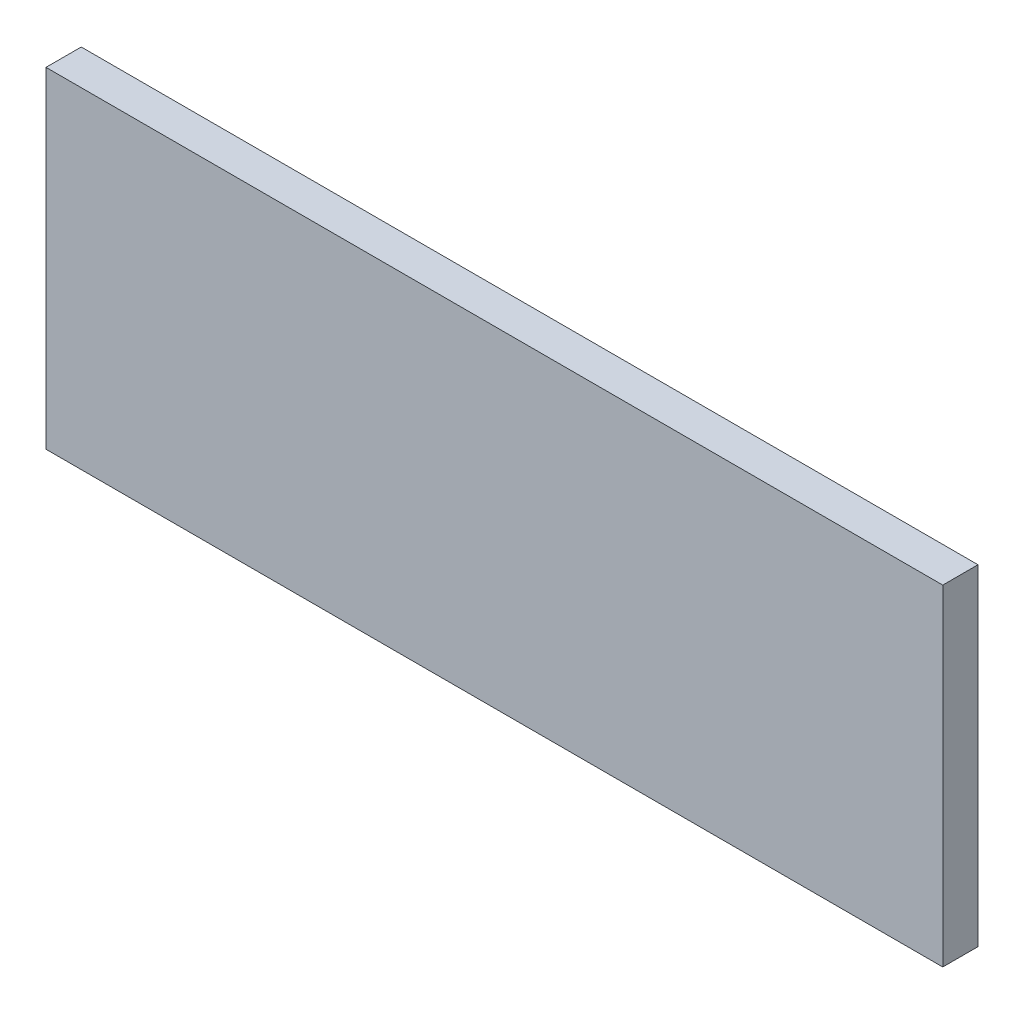
ISO-10303-21;
HEADER;
FILE_DESCRIPTION(('STEP AP214'),'2;1');
FILE_NAME('part.step','',(''),(''),'','','');
FILE_SCHEMA(('AUTOMOTIVE_DESIGN { 1 0 10303 214 1 1 1 1 }'));
ENDSEC;
DATA;
#1=APPLICATION_CONTEXT('core data for automotive mechanical design processes');
#2=APPLICATION_PROTOCOL_DEFINITION('international standard','automotive_design',2000,#1);
#3=PRODUCT_CONTEXT('',#1,'mechanical');
#4=PRODUCT('Part','Part','',(#3));
#5=PRODUCT_RELATED_PRODUCT_CATEGORY('part','',(#4));
#6=PRODUCT_DEFINITION_FORMATION('','',#4);
#7=PRODUCT_DEFINITION_CONTEXT('part definition',#1,'design');
#8=PRODUCT_DEFINITION('design','',#6,#7);
#9=PRODUCT_DEFINITION_SHAPE('','',#8);
#10=(LENGTH_UNIT() NAMED_UNIT(*) SI_UNIT(.MILLI.,.METRE.));
#11=(NAMED_UNIT(*) PLANE_ANGLE_UNIT() SI_UNIT($,.RADIAN.));
#12=(NAMED_UNIT(*) SI_UNIT($,.STERADIAN.) SOLID_ANGLE_UNIT());
#13=UNCERTAINTY_MEASURE_WITH_UNIT(LENGTH_MEASURE(1.E-05),#10,'distance_accuracy_value','');
#14=(GEOMETRIC_REPRESENTATION_CONTEXT(3) GLOBAL_UNCERTAINTY_ASSIGNED_CONTEXT((#13)) GLOBAL_UNIT_ASSIGNED_CONTEXT((#10,
#11,#12)) REPRESENTATION_CONTEXT('',''));
#15=CARTESIAN_POINT('',(0.,0.,0.));
#16=DIRECTION('',(0.,0.,1.));
#17=DIRECTION('',(1.,0.,0.));
#18=AXIS2_PLACEMENT_3D('',#15,#16,#17);
#19=CARTESIAN_POINT('',(21.62700526,7.97700208,1.70000168));
#20=DIRECTION('',(0.,0.,-1.));
#21=DIRECTION('',(-1.,0.,0.));
#22=AXIS2_PLACEMENT_3D('',#19,#20,#21);
#23=PLANE('',#22);
#24=DIRECTION('',(-6.36830925666271E-07,0.999999999999797,0.));
#25=VECTOR('',#24,1.);
#26=CARTESIAN_POINT('',(-21.62700272,7.97700208,1.70000168));
#27=LINE('',#26,#25);
#28=CARTESIAN_POINT('',(-21.62700272,7.97700208,1.70000168));
#29=VERTEX_POINT('',#28);
#30=CARTESIAN_POINT('',(-21.6269925599992,-7.97699827,1.70000168));
#31=VERTEX_POINT('',#30);
#32=EDGE_CURVE('E54',#29,#31,#27,.F.);
#33=ORIENTED_EDGE('',*,*,#32,.T.);
#34=DIRECTION('',(-0.999999999999998,5.87228990190499E-08,0.));
#35=VECTOR('',#34,1.);
#36=CARTESIAN_POINT('',(-21.62699256,-7.976997,1.70000168));
#37=LINE('',#36,#35);
#38=CARTESIAN_POINT('',(21.62700399,-7.97699954,1.70000168));
#39=VERTEX_POINT('',#38);
#40=EDGE_CURVE('E56',#31,#39,#37,.F.);
#41=ORIENTED_EDGE('',*,*,#40,.T.);
#42=DIRECTION('',(-1.59207706737598E-07,-0.999999999999987,0.));
#43=VECTOR('',#42,1.);
#44=CARTESIAN_POINT('',(21.62700272,-7.97699954,1.70000168));
#45=LINE('',#44,#43);
#46=CARTESIAN_POINT('',(21.62700526,7.97700208,1.70000168));
#47=VERTEX_POINT('',#46);
#48=EDGE_CURVE('E19',#39,#47,#45,.F.);
#49=ORIENTED_EDGE('',*,*,#48,.T.);
#50=DIRECTION('',(1.,0.,0.));
#51=VECTOR('',#50,1.);
#52=CARTESIAN_POINT('',(21.62700526,7.97700208,1.70000168));
#53=LINE('',#52,#51);
#54=EDGE_CURVE('E79',#47,#29,#53,.F.);
#55=ORIENTED_EDGE('',*,*,#54,.T.);
#56=EDGE_LOOP('',(#33,#41,#49,#55));
#57=FACE_BOUND('',#56,.T.);
#58=ADVANCED_FACE('F16',(#57),#23,.F.);
#59=CARTESIAN_POINT('',(21.62700272,-7.97699954,0.));
#60=DIRECTION('',(-0.999999999999987,1.59207706737598E-07,0.));
#61=DIRECTION('',(-1.59207706737598E-07,-0.999999999999987,0.));
#62=AXIS2_PLACEMENT_3D('',#59,#60,#61);
#63=PLANE('',#62);
#64=DIRECTION('',(0.,0.,-1.));
#65=VECTOR('',#64,1.);
#66=CARTESIAN_POINT('',(21.62700526,7.97700208,0.));
#67=LINE('',#66,#65);
#68=CARTESIAN_POINT('',(21.62700526,7.97700208,0.));
#69=VERTEX_POINT('',#68);
#70=EDGE_CURVE('E67',#69,#47,#67,.F.);
#71=ORIENTED_EDGE('',*,*,#70,.T.);
#72=ORIENTED_EDGE('',*,*,#48,.F.);
#73=DIRECTION('',(0.,0.,1.));
#74=VECTOR('',#73,1.);
#75=CARTESIAN_POINT('',(21.62700272,-7.97699954,0.));
#76=LINE('',#75,#74);
#77=CARTESIAN_POINT('',(21.627003355,-7.97699954,0.));
#78=VERTEX_POINT('',#77);
#79=EDGE_CURVE('E62',#39,#78,#76,.F.);
#80=ORIENTED_EDGE('',*,*,#79,.T.);
#81=DIRECTION('',(0.,1.,0.));
#82=VECTOR('',#81,1.);
#83=CARTESIAN_POINT('',(21.62700526,7.97700208,0.));
#84=LINE('',#83,#82);
#85=EDGE_CURVE('E82',#69,#78,#84,.F.);
#86=ORIENTED_EDGE('',*,*,#85,.F.);
#87=EDGE_LOOP('',(#71,#72,#80,#86));
#88=FACE_BOUND('',#87,.T.);
#89=ADVANCED_FACE('F64',(#88),#63,.F.);
#90=CARTESIAN_POINT('',(-21.62699256,-7.976997,0.));
#91=DIRECTION('',(5.87228990190499E-08,0.999999999999998,0.));
#92=DIRECTION('',(-0.999999999999998,5.87228990190499E-08,0.));
#93=AXIS2_PLACEMENT_3D('',#90,#91,#92);
#94=PLANE('',#93);
#95=ORIENTED_EDGE('',*,*,#79,.F.);
#96=ORIENTED_EDGE('',*,*,#40,.F.);
#97=DIRECTION('',(0.,0.,1.));
#98=VECTOR('',#97,1.);
#99=CARTESIAN_POINT('',(-21.62699256,-7.976997,0.));
#100=LINE('',#99,#98);
#101=CARTESIAN_POINT('',(-21.6269925599996,-7.976997635,0.));
#102=VERTEX_POINT('',#101);
#103=EDGE_CURVE('E74',#31,#102,#100,.F.);
#104=ORIENTED_EDGE('',*,*,#103,.T.);
#105=DIRECTION('',(-1.,0.,0.));
#106=VECTOR('',#105,1.);
#107=CARTESIAN_POINT('',(21.62700526,-7.97699954,0.));
#108=LINE('',#107,#106);
#109=EDGE_CURVE('E71',#78,#102,#108,.T.);
#110=ORIENTED_EDGE('',*,*,#109,.F.);
#111=EDGE_LOOP('',(#95,#96,#104,#110));
#112=FACE_BOUND('',#111,.T.);
#113=ADVANCED_FACE('F69',(#112),#94,.F.);
#114=CARTESIAN_POINT('',(-21.62700272,7.97700208,0.));
#115=DIRECTION('',(0.999999999999797,6.36830925666271E-07,0.));
#116=DIRECTION('',(-6.36830925666271E-07,0.999999999999797,0.));
#117=AXIS2_PLACEMENT_3D('',#114,#115,#116);
#118=PLANE('',#117);
#119=ORIENTED_EDGE('',*,*,#103,.F.);
#120=ORIENTED_EDGE('',*,*,#32,.F.);
#121=DIRECTION('',(0.,0.,-1.));
#122=VECTOR('',#121,1.);
#123=CARTESIAN_POINT('',(-21.62700272,7.97700208,0.));
#124=LINE('',#123,#122);
#125=CARTESIAN_POINT('',(-21.62700272,7.97700208,0.));
#126=VERTEX_POINT('',#125);
#127=EDGE_CURVE('E34',#29,#126,#124,.T.);
#128=ORIENTED_EDGE('',*,*,#127,.T.);
#129=DIRECTION('',(-6.36830925593481E-07,0.999999999999797,0.));
#130=VECTOR('',#129,1.);
#131=CARTESIAN_POINT('',(-21.62699256,-7.976997,0.));
#132=LINE('',#131,#130);
#133=EDGE_CURVE('E25',#102,#126,#132,.T.);
#134=ORIENTED_EDGE('',*,*,#133,.F.);
#135=EDGE_LOOP('',(#119,#120,#128,#134));
#136=FACE_BOUND('',#135,.T.);
#137=ADVANCED_FACE('F88',(#136),#118,.F.);
#138=CARTESIAN_POINT('',(21.62700526,7.97700208,0.));
#139=DIRECTION('',(0.,-1.,0.));
#140=DIRECTION('',(0.,0.,-1.));
#141=AXIS2_PLACEMENT_3D('',#138,#139,#140);
#142=PLANE('',#141);
#143=ORIENTED_EDGE('',*,*,#127,.F.);
#144=ORIENTED_EDGE('',*,*,#54,.F.);
#145=ORIENTED_EDGE('',*,*,#70,.F.);
#146=DIRECTION('',(-1.,0.,0.));
#147=VECTOR('',#146,1.);
#148=CARTESIAN_POINT('',(21.62700526,7.97700208,0.));
#149=LINE('',#148,#147);
#150=EDGE_CURVE('E11',#126,#69,#149,.F.);
#151=ORIENTED_EDGE('',*,*,#150,.F.);
#152=EDGE_LOOP('',(#143,#144,#145,#151));
#153=FACE_BOUND('',#152,.T.);
#154=ADVANCED_FACE('F90',(#153),#142,.F.);
#155=CARTESIAN_POINT('',(21.62700526,7.97700208,0.));
#156=DIRECTION('',(0.,0.,-1.));
#157=DIRECTION('',(-1.,0.,0.));
#158=AXIS2_PLACEMENT_3D('',#155,#156,#157);
#159=PLANE('',#158);
#160=ORIENTED_EDGE('',*,*,#133,.T.);
#161=ORIENTED_EDGE('',*,*,#150,.T.);
#162=ORIENTED_EDGE('',*,*,#85,.T.);
#163=ORIENTED_EDGE('',*,*,#109,.T.);
#164=EDGE_LOOP('',(#160,#161,#162,#163));
#165=FACE_BOUND('',#164,.T.);
#166=ADVANCED_FACE('F87',(#165),#159,.T.);
#167=CLOSED_SHELL('',(#58,#89,#113,#137,#154,#166));
#168=MANIFOLD_SOLID_BREP('B1',#167);
#169=ADVANCED_BREP_SHAPE_REPRESENTATION('',(#18,#168),#14);
#170=SHAPE_DEFINITION_REPRESENTATION(#9,#169);
ENDSEC;
END-ISO-10303-21;
